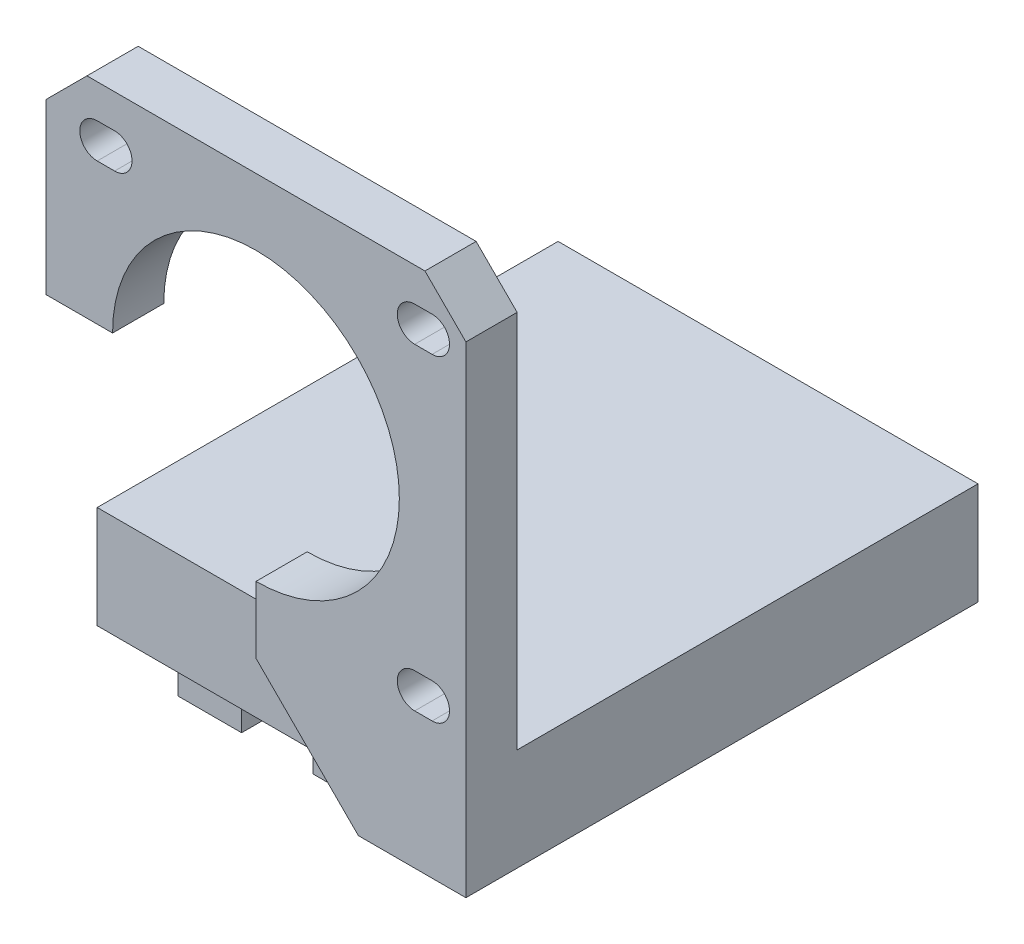
ISO-10303-21;
HEADER;
FILE_DESCRIPTION(('STEP AP214'),'2;1');
FILE_NAME('part.step','',(''),(''),'','','');
FILE_SCHEMA(('AUTOMOTIVE_DESIGN { 1 0 10303 214 1 1 1 1 }'));
ENDSEC;
DATA;
#1=APPLICATION_CONTEXT('core data for automotive mechanical design processes');
#2=APPLICATION_PROTOCOL_DEFINITION('international standard','automotive_design',2000,#1);
#3=PRODUCT_CONTEXT('',#1,'mechanical');
#4=PRODUCT('Part','Part','',(#3));
#5=PRODUCT_RELATED_PRODUCT_CATEGORY('part','',(#4));
#6=PRODUCT_DEFINITION_FORMATION('','',#4);
#7=PRODUCT_DEFINITION_CONTEXT('part definition',#1,'design');
#8=PRODUCT_DEFINITION('design','',#6,#7);
#9=PRODUCT_DEFINITION_SHAPE('','',#8);
#10=(LENGTH_UNIT() NAMED_UNIT(*) SI_UNIT(.MILLI.,.METRE.));
#11=(NAMED_UNIT(*) PLANE_ANGLE_UNIT() SI_UNIT($,.RADIAN.));
#12=(NAMED_UNIT(*) SI_UNIT($,.STERADIAN.) SOLID_ANGLE_UNIT());
#13=UNCERTAINTY_MEASURE_WITH_UNIT(LENGTH_MEASURE(1.E-05),#10,'distance_accuracy_value','');
#14=(GEOMETRIC_REPRESENTATION_CONTEXT(3) GLOBAL_UNCERTAINTY_ASSIGNED_CONTEXT((#13)) GLOBAL_UNIT_ASSIGNED_CONTEXT((#10,
#11,#12)) REPRESENTATION_CONTEXT('',''));
#15=CARTESIAN_POINT('',(0.,0.,0.));
#16=DIRECTION('',(0.,0.,1.));
#17=DIRECTION('',(1.,0.,0.));
#18=AXIS2_PLACEMENT_3D('',#15,#16,#17);
#19=CARTESIAN_POINT('',(0.,0.,0.));
#20=DIRECTION('',(0.,0.,-1.));
#21=DIRECTION('',(-1.,0.,0.));
#22=AXIS2_PLACEMENT_3D('',#19,#20,#21);
#23=PLANE('',#22);
#24=DIRECTION('',(0.,-1.,0.));
#25=VECTOR('',#24,1.);
#26=CARTESIAN_POINT('',(-20.5,0.,0.));
#27=LINE('',#26,#25);
#28=CARTESIAN_POINT('',(-20.5,-20.5,0.));
#29=VERTEX_POINT('',#28);
#30=CARTESIAN_POINT('',(-20.5,-30.5,0.));
#31=VERTEX_POINT('',#30);
#32=EDGE_CURVE('E517',#29,#31,#27,.T.);
#33=ORIENTED_EDGE('',*,*,#32,.T.);
#34=DIRECTION('',(1.,0.,0.));
#35=VECTOR('',#34,1.);
#36=CARTESIAN_POINT('',(10.0000000000003,-30.5,0.));
#37=LINE('',#36,#35);
#38=CARTESIAN_POINT('',(10.0000000000003,-30.5,0.));
#39=VERTEX_POINT('',#38);
#40=EDGE_CURVE('E506',#31,#39,#37,.T.);
#41=ORIENTED_EDGE('',*,*,#40,.T.);
#42=DIRECTION('',(-0.707106781186556,0.707106781186539,0.));
#43=VECTOR('',#42,1.);
#44=CARTESIAN_POINT('',(0.,-20.5,0.));
#45=LINE('',#44,#43);
#46=CARTESIAN_POINT('',(0.,-20.5,0.));
#47=VERTEX_POINT('',#46);
#48=EDGE_CURVE('E508',#39,#47,#45,.T.);
#49=ORIENTED_EDGE('',*,*,#48,.T.);
#50=DIRECTION('',(-1.,0.,0.));
#51=VECTOR('',#50,1.);
#52=CARTESIAN_POINT('',(20.5,-20.5,0.));
#53=LINE('',#52,#51);
#54=EDGE_CURVE('E530',#47,#29,#53,.T.);
#55=ORIENTED_EDGE('',*,*,#54,.T.);
#56=EDGE_LOOP('',(#33,#41,#49,#55));
#57=FACE_BOUND('',#56,.T.);
#58=ADVANCED_FACE('F229',(#57),#23,.F.);
#59=CARTESIAN_POINT('',(-2.45,-30.5,0.));
#60=DIRECTION('',(-1.,0.,0.));
#61=DIRECTION('',(0.,0.,1.));
#62=AXIS2_PLACEMENT_3D('',#59,#60,#61);
#63=PLANE('',#62);
#64=DIRECTION('',(0.,0.,-1.));
#65=VECTOR('',#64,1.);
#66=CARTESIAN_POINT('',(-2.45,-35.5,0.));
#67=LINE('',#66,#65);
#68=CARTESIAN_POINT('',(-2.45,-35.5,-3.));
#69=VERTEX_POINT('',#68);
#70=CARTESIAN_POINT('',(-2.44999999999999,-35.5,-45.));
#71=VERTEX_POINT('',#70);
#72=EDGE_CURVE('E493',#69,#71,#67,.T.);
#73=ORIENTED_EDGE('',*,*,#72,.F.);
#74=DIRECTION('',(0.,1.,0.));
#75=VECTOR('',#74,1.);
#76=CARTESIAN_POINT('',(-2.45,-30.5,-3.));
#77=LINE('',#76,#75);
#78=CARTESIAN_POINT('',(-2.45,-30.5,-3.));
#79=VERTEX_POINT('',#78);
#80=EDGE_CURVE('E12',#69,#79,#77,.T.);
#81=ORIENTED_EDGE('',*,*,#80,.T.);
#82=DIRECTION('',(0.,0.,-1.));
#83=VECTOR('',#82,1.);
#84=CARTESIAN_POINT('',(-2.45,-30.5,0.));
#85=LINE('',#84,#83);
#86=CARTESIAN_POINT('',(-2.45,-30.5,-45.));
#87=VERTEX_POINT('',#86);
#88=EDGE_CURVE('E251',#79,#87,#85,.T.);
#89=ORIENTED_EDGE('',*,*,#88,.T.);
#90=DIRECTION('',(0.,-1.,0.));
#91=VECTOR('',#90,1.);
#92=CARTESIAN_POINT('',(-2.44999999999999,-30.5,-45.));
#93=LINE('',#92,#91);
#94=EDGE_CURVE('E496',#87,#71,#93,.T.);
#95=ORIENTED_EDGE('',*,*,#94,.T.);
#96=EDGE_LOOP('',(#73,#81,#89,#95));
#97=FACE_BOUND('',#96,.T.);
#98=ADVANCED_FACE('F779',(#97),#63,.T.);
#99=CARTESIAN_POINT('',(-15.6,-30.5,0.));
#100=DIRECTION('',(-1.,0.,0.));
#101=DIRECTION('',(0.,0.,1.));
#102=AXIS2_PLACEMENT_3D('',#99,#100,#101);
#103=PLANE('',#102);
#104=DIRECTION('',(0.,0.,-1.));
#105=VECTOR('',#104,1.);
#106=CARTESIAN_POINT('',(-15.6,-35.5,0.));
#107=LINE('',#106,#105);
#108=CARTESIAN_POINT('',(-15.6,-35.5,-3.));
#109=VERTEX_POINT('',#108);
#110=CARTESIAN_POINT('',(-15.6,-35.5,-45.));
#111=VERTEX_POINT('',#110);
#112=EDGE_CURVE('E490',#109,#111,#107,.T.);
#113=ORIENTED_EDGE('',*,*,#112,.F.);
#114=DIRECTION('',(0.,-1.,0.));
#115=VECTOR('',#114,1.);
#116=CARTESIAN_POINT('',(-15.6,-30.5,-3.));
#117=LINE('',#116,#115);
#118=CARTESIAN_POINT('',(-15.6,-30.5,-3.));
#119=VERTEX_POINT('',#118);
#120=EDGE_CURVE('E486',#119,#109,#117,.T.);
#121=ORIENTED_EDGE('',*,*,#120,.F.);
#122=DIRECTION('',(0.,0.,-1.));
#123=VECTOR('',#122,1.);
#124=CARTESIAN_POINT('',(-15.6,-30.5,0.));
#125=LINE('',#124,#123);
#126=CARTESIAN_POINT('',(-15.6,-30.5,-45.));
#127=VERTEX_POINT('',#126);
#128=EDGE_CURVE('E244',#119,#127,#125,.T.);
#129=ORIENTED_EDGE('',*,*,#128,.T.);
#130=DIRECTION('',(0.,-1.,0.));
#131=VECTOR('',#130,1.);
#132=CARTESIAN_POINT('',(-15.6,-30.5,-45.));
#133=LINE('',#132,#131);
#134=EDGE_CURVE('E483',#127,#111,#133,.T.);
#135=ORIENTED_EDGE('',*,*,#134,.T.);
#136=EDGE_LOOP('',(#113,#121,#129,#135));
#137=FACE_BOUND('',#136,.T.);
#138=ADVANCED_FACE('F761',(#137),#103,.T.);
#139=CARTESIAN_POINT('',(0.,0.,5.));
#140=DIRECTION('',(0.,0.,1.));
#141=DIRECTION('',(1.,0.,0.));
#142=AXIS2_PLACEMENT_3D('',#139,#140,#141);
#143=PLANE('',#142);
#144=DIRECTION('',(-1.,0.,0.));
#145=VECTOR('',#144,1.);
#146=CARTESIAN_POINT('',(17.2,17.2,5.));
#147=LINE('',#146,#145);
#148=CARTESIAN_POINT('',(17.2,17.2,5.));
#149=VERTEX_POINT('',#148);
#150=CARTESIAN_POINT('',(15.5,17.2,5.));
#151=VERTEX_POINT('',#150);
#152=EDGE_CURVE('E564',#149,#151,#147,.T.);
#153=ORIENTED_EDGE('',*,*,#152,.F.);
#154=CARTESIAN_POINT('',(17.2,15.5,5.));
#155=DIRECTION('',(0.,0.,1.));
#156=DIRECTION('',(1.,0.,0.));
#157=AXIS2_PLACEMENT_3D('',#154,#155,#156);
#158=CIRCLE('',#157,1.7);
#159=CARTESIAN_POINT('',(17.2,13.8,5.));
#160=VERTEX_POINT('',#159);
#161=EDGE_CURVE('E599',#160,#149,#158,.T.);
#162=ORIENTED_EDGE('',*,*,#161,.F.);
#163=DIRECTION('',(1.,0.,0.));
#164=VECTOR('',#163,1.);
#165=CARTESIAN_POINT('',(15.5,13.8,5.));
#166=LINE('',#165,#164);
#167=CARTESIAN_POINT('',(15.5,13.8,5.));
#168=VERTEX_POINT('',#167);
#169=EDGE_CURVE('E607',#168,#160,#166,.T.);
#170=ORIENTED_EDGE('',*,*,#169,.F.);
#171=CARTESIAN_POINT('',(15.5,15.5,5.));
#172=DIRECTION('',(0.,0.,1.));
#173=DIRECTION('',(1.,0.,0.));
#174=AXIS2_PLACEMENT_3D('',#171,#172,#173);
#175=CIRCLE('',#174,1.7);
#176=EDGE_CURVE('E655',#151,#168,#175,.T.);
#177=ORIENTED_EDGE('',*,*,#176,.F.);
#178=EDGE_LOOP('',(#153,#162,#170,#177));
#179=FACE_BOUND('',#178,.T.);
#180=DIRECTION('',(-1.,0.,0.));
#181=VECTOR('',#180,1.);
#182=CARTESIAN_POINT('',(17.2,-13.8,5.));
#183=LINE('',#182,#181);
#184=CARTESIAN_POINT('',(17.2,-13.8,5.));
#185=VERTEX_POINT('',#184);
#186=CARTESIAN_POINT('',(15.5,-13.8,5.));
#187=VERTEX_POINT('',#186);
#188=EDGE_CURVE('E554',#185,#187,#183,.T.);
#189=ORIENTED_EDGE('',*,*,#188,.F.);
#190=CARTESIAN_POINT('',(17.2,-15.5,5.));
#191=DIRECTION('',(0.,0.,1.));
#192=DIRECTION('',(1.,0.,0.));
#193=AXIS2_PLACEMENT_3D('',#190,#191,#192);
#194=CIRCLE('',#193,1.7);
#195=CARTESIAN_POINT('',(17.2,-17.2,5.));
#196=VERTEX_POINT('',#195);
#197=EDGE_CURVE('E547',#196,#185,#194,.T.);
#198=ORIENTED_EDGE('',*,*,#197,.F.);
#199=DIRECTION('',(1.,0.,0.));
#200=VECTOR('',#199,1.);
#201=CARTESIAN_POINT('',(15.5,-17.2,5.));
#202=LINE('',#201,#200);
#203=CARTESIAN_POINT('',(15.5,-17.2,5.));
#204=VERTEX_POINT('',#203);
#205=EDGE_CURVE('E556',#204,#196,#202,.T.);
#206=ORIENTED_EDGE('',*,*,#205,.F.);
#207=CARTESIAN_POINT('',(15.5,-15.5,5.));
#208=DIRECTION('',(0.,0.,1.));
#209=DIRECTION('',(1.,0.,0.));
#210=AXIS2_PLACEMENT_3D('',#207,#208,#209);
#211=CIRCLE('',#210,1.7);
#212=EDGE_CURVE('E649',#187,#204,#211,.T.);
#213=ORIENTED_EDGE('',*,*,#212,.F.);
#214=EDGE_LOOP('',(#189,#198,#206,#213));
#215=FACE_BOUND('',#214,.T.);
#216=DIRECTION('',(-1.,0.,0.));
#217=VECTOR('',#216,1.);
#218=CARTESIAN_POINT('',(-13.8,17.2,5.));
#219=LINE('',#218,#217);
#220=CARTESIAN_POINT('',(-13.8,17.2,5.));
#221=VERTEX_POINT('',#220);
#222=CARTESIAN_POINT('',(-15.5,17.2,5.));
#223=VERTEX_POINT('',#222);
#224=EDGE_CURVE('E542',#221,#223,#219,.T.);
#225=ORIENTED_EDGE('',*,*,#224,.F.);
#226=CARTESIAN_POINT('',(-13.8,15.5,5.));
#227=DIRECTION('',(0.,0.,1.));
#228=DIRECTION('',(1.,0.,0.));
#229=AXIS2_PLACEMENT_3D('',#226,#227,#228);
#230=CIRCLE('',#229,1.7);
#231=CARTESIAN_POINT('',(-13.8,13.8,5.));
#232=VERTEX_POINT('',#231);
#233=EDGE_CURVE('E575',#232,#221,#230,.T.);
#234=ORIENTED_EDGE('',*,*,#233,.F.);
#235=DIRECTION('',(1.,0.,0.));
#236=VECTOR('',#235,1.);
#237=CARTESIAN_POINT('',(-15.5,13.8,5.));
#238=LINE('',#237,#236);
#239=CARTESIAN_POINT('',(-15.5,13.8,5.));
#240=VERTEX_POINT('',#239);
#241=EDGE_CURVE('E583',#240,#232,#238,.T.);
#242=ORIENTED_EDGE('',*,*,#241,.F.);
#243=CARTESIAN_POINT('',(-15.5,15.5,5.));
#244=DIRECTION('',(0.,0.,1.));
#245=DIRECTION('',(1.,0.,0.));
#246=AXIS2_PLACEMENT_3D('',#243,#244,#245);
#247=CIRCLE('',#246,1.7);
#248=EDGE_CURVE('E661',#223,#240,#247,.T.);
#249=ORIENTED_EDGE('',*,*,#248,.F.);
#250=EDGE_LOOP('',(#225,#234,#242,#249));
#251=FACE_BOUND('',#250,.T.);
#252=CARTESIAN_POINT('',(0.,0.,5.));
#253=DIRECTION('',(0.,0.,1.));
#254=DIRECTION('',(1.,0.,0.));
#255=AXIS2_PLACEMENT_3D('',#252,#253,#254);
#256=CIRCLE('',#255,14.);
#257=CARTESIAN_POINT('',(0.,-14.,5.));
#258=VERTEX_POINT('',#257);
#259=CARTESIAN_POINT('',(-14.,0.,5.));
#260=VERTEX_POINT('',#259);
#261=EDGE_CURVE('E534',#258,#260,#256,.T.);
#262=ORIENTED_EDGE('',*,*,#261,.F.);
#263=DIRECTION('',(0.,-1.,0.));
#264=VECTOR('',#263,1.);
#265=CARTESIAN_POINT('',(0.,0.,5.));
#266=LINE('',#265,#264);
#267=CARTESIAN_POINT('',(0.,-20.5,5.));
#268=VERTEX_POINT('',#267);
#269=EDGE_CURVE('E513',#258,#268,#266,.T.);
#270=ORIENTED_EDGE('',*,*,#269,.T.);
#271=DIRECTION('',(0.707106781186556,-0.707106781186539,0.));
#272=VECTOR('',#271,1.);
#273=CARTESIAN_POINT('',(0.,-20.5,5.));
#274=LINE('',#273,#272);
#275=CARTESIAN_POINT('',(10.0000000000003,-30.5,5.));
#276=VERTEX_POINT('',#275);
#277=EDGE_CURVE('E500',#268,#276,#274,.T.);
#278=ORIENTED_EDGE('',*,*,#277,.T.);
#279=DIRECTION('',(1.,0.,0.));
#280=VECTOR('',#279,1.);
#281=CARTESIAN_POINT('',(10.0000000000003,-30.5,5.));
#282=LINE('',#281,#280);
#283=CARTESIAN_POINT('',(20.5,-30.5,5.));
#284=VERTEX_POINT('',#283);
#285=EDGE_CURVE('E503',#276,#284,#282,.T.);
#286=ORIENTED_EDGE('',*,*,#285,.T.);
#287=DIRECTION('',(0.,1.,0.));
#288=VECTOR('',#287,1.);
#289=CARTESIAN_POINT('',(20.5,0.,5.));
#290=LINE('',#289,#288);
#291=CARTESIAN_POINT('',(20.5,16.5,5.));
#292=VERTEX_POINT('',#291);
#293=EDGE_CURVE('E674',#284,#292,#290,.T.);
#294=ORIENTED_EDGE('',*,*,#293,.T.);
#295=DIRECTION('',(0.707106781186548,-0.707106781186548,0.));
#296=VECTOR('',#295,1.);
#297=CARTESIAN_POINT('',(16.5,20.5,5.));
#298=LINE('',#297,#296);
#299=CARTESIAN_POINT('',(16.5,20.5,5.));
#300=VERTEX_POINT('',#299);
#301=EDGE_CURVE('E670',#300,#292,#298,.T.);
#302=ORIENTED_EDGE('',*,*,#301,.F.);
#303=DIRECTION('',(1.,0.,0.));
#304=VECTOR('',#303,1.);
#305=CARTESIAN_POINT('',(0.,20.5,5.));
#306=LINE('',#305,#304);
#307=CARTESIAN_POINT('',(-16.5,20.5,5.));
#308=VERTEX_POINT('',#307);
#309=EDGE_CURVE('E667',#308,#300,#306,.T.);
#310=ORIENTED_EDGE('',*,*,#309,.F.);
#311=DIRECTION('',(0.707106781186548,0.707106781186548,0.));
#312=VECTOR('',#311,1.);
#313=CARTESIAN_POINT('',(-20.5,16.5,5.));
#314=LINE('',#313,#312);
#315=CARTESIAN_POINT('',(-20.5,16.5,5.));
#316=VERTEX_POINT('',#315);
#317=EDGE_CURVE('E679',#316,#308,#314,.T.);
#318=ORIENTED_EDGE('',*,*,#317,.F.);
#319=DIRECTION('',(0.,-1.,0.));
#320=VECTOR('',#319,1.);
#321=CARTESIAN_POINT('',(-20.5,0.,5.));
#322=LINE('',#321,#320);
#323=CARTESIAN_POINT('',(-20.5,0.,5.));
#324=VERTEX_POINT('',#323);
#325=EDGE_CURVE('E676',#316,#324,#322,.T.);
#326=ORIENTED_EDGE('',*,*,#325,.T.);
#327=DIRECTION('',(-1.,0.,0.));
#328=VECTOR('',#327,1.);
#329=CARTESIAN_POINT('',(0.,0.,5.));
#330=LINE('',#329,#328);
#331=EDGE_CURVE('E518',#260,#324,#330,.T.);
#332=ORIENTED_EDGE('',*,*,#331,.F.);
#333=EDGE_LOOP('',(#262,#270,#278,#286,#294,#302,#310,#318,#326,#332));
#334=FACE_BOUND('',#333,.T.);
#335=ADVANCED_FACE('F724',(#179,#215,#251,#334),#143,.T.);
#336=CARTESIAN_POINT('',(0.,0.,0.));
#337=DIRECTION('',(0.,0.,1.));
#338=DIRECTION('',(1.,0.,0.));
#339=AXIS2_PLACEMENT_3D('',#336,#337,#338);
#340=PLANE('',#339);
#341=CARTESIAN_POINT('',(17.2,-15.5,0.));
#342=DIRECTION('',(0.,0.,1.));
#343=DIRECTION('',(1.,0.,0.));
#344=AXIS2_PLACEMENT_3D('',#341,#342,#343);
#345=CIRCLE('',#344,1.7);
#346=CARTESIAN_POINT('',(17.2,-17.2,0.));
#347=VERTEX_POINT('',#346);
#348=CARTESIAN_POINT('',(17.2,-13.8,0.));
#349=VERTEX_POINT('',#348);
#350=EDGE_CURVE('E550',#347,#349,#345,.T.);
#351=ORIENTED_EDGE('',*,*,#350,.T.);
#352=DIRECTION('',(-1.,0.,0.));
#353=VECTOR('',#352,1.);
#354=CARTESIAN_POINT('',(17.2,-13.8,0.));
#355=LINE('',#354,#353);
#356=CARTESIAN_POINT('',(15.5,-13.8,0.));
#357=VERTEX_POINT('',#356);
#358=EDGE_CURVE('E543',#349,#357,#355,.T.);
#359=ORIENTED_EDGE('',*,*,#358,.T.);
#360=CARTESIAN_POINT('',(15.5,-15.5,0.));
#361=DIRECTION('',(0.,0.,1.));
#362=DIRECTION('',(1.,0.,0.));
#363=AXIS2_PLACEMENT_3D('',#360,#361,#362);
#364=CIRCLE('',#363,1.7);
#365=CARTESIAN_POINT('',(15.5,-17.2,0.));
#366=VERTEX_POINT('',#365);
#367=EDGE_CURVE('E646',#357,#366,#364,.T.);
#368=ORIENTED_EDGE('',*,*,#367,.T.);
#369=DIRECTION('',(1.,0.,0.));
#370=VECTOR('',#369,1.);
#371=CARTESIAN_POINT('',(15.5,-17.2,0.));
#372=LINE('',#371,#370);
#373=EDGE_CURVE('E546',#366,#347,#372,.T.);
#374=ORIENTED_EDGE('',*,*,#373,.T.);
#375=EDGE_LOOP('',(#351,#359,#368,#374));
#376=FACE_BOUND('',#375,.T.);
#377=CARTESIAN_POINT('',(17.2,15.5,0.));
#378=DIRECTION('',(0.,0.,1.));
#379=DIRECTION('',(1.,0.,0.));
#380=AXIS2_PLACEMENT_3D('',#377,#378,#379);
#381=CIRCLE('',#380,1.7);
#382=CARTESIAN_POINT('',(17.2,13.8,0.));
#383=VERTEX_POINT('',#382);
#384=CARTESIAN_POINT('',(17.2,17.2,0.));
#385=VERTEX_POINT('',#384);
#386=EDGE_CURVE('E602',#383,#385,#381,.T.);
#387=ORIENTED_EDGE('',*,*,#386,.T.);
#388=DIRECTION('',(-1.,0.,0.));
#389=VECTOR('',#388,1.);
#390=CARTESIAN_POINT('',(17.2,17.2,0.));
#391=LINE('',#390,#389);
#392=CARTESIAN_POINT('',(15.5,17.2,0.));
#393=VERTEX_POINT('',#392);
#394=EDGE_CURVE('E595',#385,#393,#391,.T.);
#395=ORIENTED_EDGE('',*,*,#394,.T.);
#396=CARTESIAN_POINT('',(15.5,15.5,0.));
#397=DIRECTION('',(0.,0.,1.));
#398=DIRECTION('',(1.,0.,0.));
#399=AXIS2_PLACEMENT_3D('',#396,#397,#398);
#400=CIRCLE('',#399,1.7);
#401=CARTESIAN_POINT('',(15.5,13.8,0.));
#402=VERTEX_POINT('',#401);
#403=EDGE_CURVE('E652',#393,#402,#400,.T.);
#404=ORIENTED_EDGE('',*,*,#403,.T.);
#405=DIRECTION('',(1.,0.,0.));
#406=VECTOR('',#405,1.);
#407=CARTESIAN_POINT('',(15.5,13.8,0.));
#408=LINE('',#407,#406);
#409=EDGE_CURVE('E598',#402,#383,#408,.T.);
#410=ORIENTED_EDGE('',*,*,#409,.T.);
#411=EDGE_LOOP('',(#387,#395,#404,#410));
#412=FACE_BOUND('',#411,.T.);
#413=CARTESIAN_POINT('',(-13.8,15.5,0.));
#414=DIRECTION('',(0.,0.,1.));
#415=DIRECTION('',(1.,0.,0.));
#416=AXIS2_PLACEMENT_3D('',#413,#414,#415);
#417=CIRCLE('',#416,1.7);
#418=CARTESIAN_POINT('',(-13.8,13.8,0.));
#419=VERTEX_POINT('',#418);
#420=CARTESIAN_POINT('',(-13.8,17.2,0.));
#421=VERTEX_POINT('',#420);
#422=EDGE_CURVE('E578',#419,#421,#417,.T.);
#423=ORIENTED_EDGE('',*,*,#422,.T.);
#424=DIRECTION('',(-1.,0.,0.));
#425=VECTOR('',#424,1.);
#426=CARTESIAN_POINT('',(-13.8,17.2,0.));
#427=LINE('',#426,#425);
#428=CARTESIAN_POINT('',(-15.5,17.2,0.));
#429=VERTEX_POINT('',#428);
#430=EDGE_CURVE('E571',#421,#429,#427,.T.);
#431=ORIENTED_EDGE('',*,*,#430,.T.);
#432=CARTESIAN_POINT('',(-15.5,15.5,0.));
#433=DIRECTION('',(0.,0.,1.));
#434=DIRECTION('',(1.,0.,0.));
#435=AXIS2_PLACEMENT_3D('',#432,#433,#434);
#436=CIRCLE('',#435,1.7);
#437=CARTESIAN_POINT('',(-15.5,13.8,0.));
#438=VERTEX_POINT('',#437);
#439=EDGE_CURVE('E658',#429,#438,#436,.T.);
#440=ORIENTED_EDGE('',*,*,#439,.T.);
#441=DIRECTION('',(1.,0.,0.));
#442=VECTOR('',#441,1.);
#443=CARTESIAN_POINT('',(-15.5,13.8,0.));
#444=LINE('',#443,#442);
#445=EDGE_CURVE('E574',#438,#419,#444,.T.);
#446=ORIENTED_EDGE('',*,*,#445,.T.);
#447=EDGE_LOOP('',(#423,#431,#440,#446));
#448=FACE_BOUND('',#447,.T.);
#449=DIRECTION('',(0.,-1.,0.));
#450=VECTOR('',#449,1.);
#451=CARTESIAN_POINT('',(0.,0.,0.));
#452=LINE('',#451,#450);
#453=CARTESIAN_POINT('',(0.,-14.,0.));
#454=VERTEX_POINT('',#453);
#455=EDGE_CURVE('E514',#454,#47,#452,.T.);
#456=ORIENTED_EDGE('',*,*,#455,.F.);
#457=CARTESIAN_POINT('',(0.,0.,0.));
#458=DIRECTION('',(0.,0.,1.));
#459=DIRECTION('',(1.,0.,0.));
#460=AXIS2_PLACEMENT_3D('',#457,#458,#459);
#461=CIRCLE('',#460,14.);
#462=CARTESIAN_POINT('',(-14.,0.,0.));
#463=VERTEX_POINT('',#462);
#464=EDGE_CURVE('E535',#454,#463,#461,.T.);
#465=ORIENTED_EDGE('',*,*,#464,.T.);
#466=DIRECTION('',(-1.,0.,0.));
#467=VECTOR('',#466,1.);
#468=CARTESIAN_POINT('',(0.,0.,0.));
#469=LINE('',#468,#467);
#470=CARTESIAN_POINT('',(-20.5,0.,0.));
#471=VERTEX_POINT('',#470);
#472=EDGE_CURVE('E521',#463,#471,#469,.T.);
#473=ORIENTED_EDGE('',*,*,#472,.T.);
#474=DIRECTION('',(0.,1.,0.));
#475=VECTOR('',#474,1.);
#476=CARTESIAN_POINT('',(-20.5,0.,0.));
#477=LINE('',#476,#475);
#478=CARTESIAN_POINT('',(-20.5,16.5,0.));
#479=VERTEX_POINT('',#478);
#480=EDGE_CURVE('E688',#471,#479,#477,.T.);
#481=ORIENTED_EDGE('',*,*,#480,.T.);
#482=DIRECTION('',(0.707106781186548,0.707106781186548,0.));
#483=VECTOR('',#482,1.);
#484=CARTESIAN_POINT('',(-20.5,16.5,0.));
#485=LINE('',#484,#483);
#486=CARTESIAN_POINT('',(-16.5,20.5,0.));
#487=VERTEX_POINT('',#486);
#488=EDGE_CURVE('E690',#479,#487,#485,.T.);
#489=ORIENTED_EDGE('',*,*,#488,.T.);
#490=DIRECTION('',(-1.,0.,0.));
#491=VECTOR('',#490,1.);
#492=CARTESIAN_POINT('',(0.,20.5,0.));
#493=LINE('',#492,#491);
#494=CARTESIAN_POINT('',(16.5,20.5,0.));
#495=VERTEX_POINT('',#494);
#496=EDGE_CURVE('E671',#495,#487,#493,.T.);
#497=ORIENTED_EDGE('',*,*,#496,.F.);
#498=DIRECTION('',(0.707106781186548,-0.707106781186548,0.));
#499=VECTOR('',#498,1.);
#500=CARTESIAN_POINT('',(16.5,20.5,0.));
#501=LINE('',#500,#499);
#502=CARTESIAN_POINT('',(20.5,16.5,0.));
#503=VERTEX_POINT('',#502);
#504=EDGE_CURVE('E664',#495,#503,#501,.T.);
#505=ORIENTED_EDGE('',*,*,#504,.T.);
#506=DIRECTION('',(0.,-1.,0.));
#507=VECTOR('',#506,1.);
#508=CARTESIAN_POINT('',(20.5,0.,0.));
#509=LINE('',#508,#507);
#510=CARTESIAN_POINT('',(20.5,-20.5,0.));
#511=VERTEX_POINT('',#510);
#512=EDGE_CURVE('E685',#503,#511,#509,.T.);
#513=ORIENTED_EDGE('',*,*,#512,.T.);
#514=DIRECTION('',(-1.,0.,0.));
#515=VECTOR('',#514,1.);
#516=CARTESIAN_POINT('',(20.5,-20.5,0.));
#517=LINE('',#516,#515);
#518=EDGE_CURVE('E622',#511,#47,#517,.T.);
#519=ORIENTED_EDGE('',*,*,#518,.T.);
#520=EDGE_LOOP('',(#456,#465,#473,#481,#489,#497,#505,#513,#519));
#521=FACE_BOUND('',#520,.T.);
#522=ADVANCED_FACE('F717',(#376,#412,#448,#521),#340,.F.);
#523=CARTESIAN_POINT('',(-20.5,0.,5.));
#524=DIRECTION('',(-1.,0.,0.));
#525=DIRECTION('',(0.,0.,1.));
#526=AXIS2_PLACEMENT_3D('',#523,#524,#525);
#527=PLANE('',#526);
#528=DIRECTION('',(0.,0.,1.));
#529=VECTOR('',#528,1.);
#530=CARTESIAN_POINT('',(-20.5,0.,0.));
#531=LINE('',#530,#529);
#532=EDGE_CURVE('E524',#471,#324,#531,.T.);
#533=ORIENTED_EDGE('',*,*,#532,.T.);
#534=ORIENTED_EDGE('',*,*,#325,.F.);
#535=DIRECTION('',(0.,0.,-1.));
#536=VECTOR('',#535,1.);
#537=CARTESIAN_POINT('',(-20.5,16.5,5.));
#538=LINE('',#537,#536);
#539=EDGE_CURVE('E698',#316,#479,#538,.T.);
#540=ORIENTED_EDGE('',*,*,#539,.T.);
#541=ORIENTED_EDGE('',*,*,#480,.F.);
#542=EDGE_LOOP('',(#533,#534,#540,#541));
#543=FACE_BOUND('',#542,.T.);
#544=ADVANCED_FACE('F728',(#543),#527,.T.);
#545=CARTESIAN_POINT('',(0.,0.,0.));
#546=DIRECTION('',(0.,0.,1.));
#547=DIRECTION('',(1.,0.,0.));
#548=AXIS2_PLACEMENT_3D('',#545,#546,#547);
#549=CYLINDRICAL_SURFACE('',#548,14.);
#550=DIRECTION('',(0.,0.,1.));
#551=VECTOR('',#550,1.);
#552=CARTESIAN_POINT('',(0.,-14.,0.));
#553=LINE('',#552,#551);
#554=EDGE_CURVE('E237',#258,#454,#553,.F.);
#555=ORIENTED_EDGE('',*,*,#554,.F.);
#556=ORIENTED_EDGE('',*,*,#261,.T.);
#557=DIRECTION('',(0.,0.,1.));
#558=VECTOR('',#557,1.);
#559=CARTESIAN_POINT('',(-14.,0.,0.));
#560=LINE('',#559,#558);
#561=EDGE_CURVE('E697',#260,#463,#560,.F.);
#562=ORIENTED_EDGE('',*,*,#561,.T.);
#563=ORIENTED_EDGE('',*,*,#464,.F.);
#564=EDGE_LOOP('',(#555,#556,#562,#563));
#565=FACE_BOUND('',#564,.T.);
#566=ADVANCED_FACE('F719',(#565),#549,.F.);
#567=CARTESIAN_POINT('',(0.,20.5,5.));
#568=DIRECTION('',(0.,-1.,0.));
#569=DIRECTION('',(0.,0.,-1.));
#570=AXIS2_PLACEMENT_3D('',#567,#568,#569);
#571=PLANE('',#570);
#572=ORIENTED_EDGE('',*,*,#496,.T.);
#573=DIRECTION('',(0.,0.,-1.));
#574=VECTOR('',#573,1.);
#575=CARTESIAN_POINT('',(-16.5,20.5,5.));
#576=LINE('',#575,#574);
#577=EDGE_CURVE('E695',#308,#487,#576,.T.);
#578=ORIENTED_EDGE('',*,*,#577,.F.);
#579=ORIENTED_EDGE('',*,*,#309,.T.);
#580=DIRECTION('',(0.,0.,-1.));
#581=VECTOR('',#580,1.);
#582=CARTESIAN_POINT('',(16.5,20.5,5.));
#583=LINE('',#582,#581);
#584=EDGE_CURVE('E682',#300,#495,#583,.T.);
#585=ORIENTED_EDGE('',*,*,#584,.T.);
#586=EDGE_LOOP('',(#572,#578,#579,#585));
#587=FACE_BOUND('',#586,.T.);
#588=ADVANCED_FACE('F736',(#587),#571,.F.);
#589=CARTESIAN_POINT('',(-20.5,16.5,5.));
#590=DIRECTION('',(-0.707106781186548,0.707106781186548,0.));
#591=DIRECTION('',(-0.707106781186548,-0.707106781186548,0.));
#592=AXIS2_PLACEMENT_3D('',#589,#590,#591);
#593=PLANE('',#592);
#594=ORIENTED_EDGE('',*,*,#488,.F.);
#595=ORIENTED_EDGE('',*,*,#539,.F.);
#596=ORIENTED_EDGE('',*,*,#317,.T.);
#597=ORIENTED_EDGE('',*,*,#577,.T.);
#598=EDGE_LOOP('',(#594,#595,#596,#597));
#599=FACE_BOUND('',#598,.T.);
#600=ADVANCED_FACE('F732',(#599),#593,.T.);
#601=ORIENTED_EDGE('',*,*,#32,.F.);
#602=DIRECTION('',(0.,0.,1.));
#603=VECTOR('',#602,1.);
#604=CARTESIAN_POINT('',(-20.5,-20.5,-45.));
#605=LINE('',#604,#603);
#606=CARTESIAN_POINT('',(-20.5,-20.5,-45.));
#607=VERTEX_POINT('',#606);
#608=EDGE_CURVE('E639',#607,#29,#605,.T.);
#609=ORIENTED_EDGE('',*,*,#608,.F.);
#610=DIRECTION('',(0.,-1.,0.));
#611=VECTOR('',#610,1.);
#612=CARTESIAN_POINT('',(-20.5,-20.5,-45.));
#613=LINE('',#612,#611);
#614=CARTESIAN_POINT('',(-20.5,-30.5,-45.));
#615=VERTEX_POINT('',#614);
#616=EDGE_CURVE('E623',#607,#615,#613,.T.);
#617=ORIENTED_EDGE('',*,*,#616,.T.);
#618=DIRECTION('',(0.,0.,-1.));
#619=VECTOR('',#618,1.);
#620=CARTESIAN_POINT('',(-20.5,-30.5,4.));
#621=LINE('',#620,#619);
#622=EDGE_CURVE('E644',#31,#615,#621,.T.);
#623=ORIENTED_EDGE('',*,*,#622,.F.);
#624=EDGE_LOOP('',(#601,#609,#617,#623));
#625=FACE_BOUND('',#624,.T.);
#626=ADVANCED_FACE('F752',(#625),#527,.T.);
#627=CARTESIAN_POINT('',(20.5,0.,5.));
#628=DIRECTION('',(1.,0.,0.));
#629=DIRECTION('',(0.,0.,-1.));
#630=AXIS2_PLACEMENT_3D('',#627,#628,#629);
#631=PLANE('',#630);
#632=ORIENTED_EDGE('',*,*,#512,.F.);
#633=DIRECTION('',(0.,0.,-1.));
#634=VECTOR('',#633,1.);
#635=CARTESIAN_POINT('',(20.5,16.5,5.));
#636=LINE('',#635,#634);
#637=EDGE_CURVE('E701',#292,#503,#636,.T.);
#638=ORIENTED_EDGE('',*,*,#637,.F.);
#639=ORIENTED_EDGE('',*,*,#293,.F.);
#640=DIRECTION('',(0.,0.,-1.));
#641=VECTOR('',#640,1.);
#642=CARTESIAN_POINT('',(20.5,-30.5,4.));
#643=LINE('',#642,#641);
#644=CARTESIAN_POINT('',(20.5,-30.5,-45.));
#645=VERTEX_POINT('',#644);
#646=EDGE_CURVE('E642',#284,#645,#643,.T.);
#647=ORIENTED_EDGE('',*,*,#646,.T.);
#648=DIRECTION('',(0.,1.,0.));
#649=VECTOR('',#648,1.);
#650=CARTESIAN_POINT('',(20.5,-30.5,-45.));
#651=LINE('',#650,#649);
#652=CARTESIAN_POINT('',(20.5,-20.5,-45.));
#653=VERTEX_POINT('',#652);
#654=EDGE_CURVE('E629',#645,#653,#651,.T.);
#655=ORIENTED_EDGE('',*,*,#654,.T.);
#656=DIRECTION('',(0.,0.,1.));
#657=VECTOR('',#656,1.);
#658=CARTESIAN_POINT('',(20.5,-20.5,-45.));
#659=LINE('',#658,#657);
#660=EDGE_CURVE('E636',#653,#511,#659,.T.);
#661=ORIENTED_EDGE('',*,*,#660,.T.);
#662=EDGE_LOOP('',(#632,#638,#639,#647,#655,#661));
#663=FACE_BOUND('',#662,.T.);
#664=ADVANCED_FACE('F741',(#663),#631,.T.);
#665=CARTESIAN_POINT('',(16.5,20.5,5.));
#666=DIRECTION('',(0.707106781186548,0.707106781186548,0.));
#667=DIRECTION('',(-0.707106781186548,0.707106781186548,0.));
#668=AXIS2_PLACEMENT_3D('',#665,#666,#667);
#669=PLANE('',#668);
#670=ORIENTED_EDGE('',*,*,#504,.F.);
#671=ORIENTED_EDGE('',*,*,#584,.F.);
#672=ORIENTED_EDGE('',*,*,#301,.T.);
#673=ORIENTED_EDGE('',*,*,#637,.T.);
#674=EDGE_LOOP('',(#670,#671,#672,#673));
#675=FACE_BOUND('',#674,.T.);
#676=ADVANCED_FACE('F231',(#675),#669,.T.);
#677=CARTESIAN_POINT('',(-15.5,15.5,5.));
#678=DIRECTION('',(0.,0.,-1.));
#679=DIRECTION('',(-1.,0.,0.));
#680=AXIS2_PLACEMENT_3D('',#677,#678,#679);
#681=CYLINDRICAL_SURFACE('',#680,1.7);
#682=DIRECTION('',(0.,0.,1.));
#683=VECTOR('',#682,1.);
#684=CARTESIAN_POINT('',(-15.5,17.2,0.));
#685=LINE('',#684,#683);
#686=EDGE_CURVE('E581',#429,#223,#685,.T.);
#687=ORIENTED_EDGE('',*,*,#686,.T.);
#688=ORIENTED_EDGE('',*,*,#248,.T.);
#689=DIRECTION('',(0.,0.,1.));
#690=VECTOR('',#689,1.);
#691=CARTESIAN_POINT('',(-15.5,13.8,0.));
#692=LINE('',#691,#690);
#693=EDGE_CURVE('E591',#438,#240,#692,.T.);
#694=ORIENTED_EDGE('',*,*,#693,.F.);
#695=ORIENTED_EDGE('',*,*,#439,.F.);
#696=EDGE_LOOP('',(#687,#688,#694,#695));
#697=FACE_BOUND('',#696,.T.);
#698=ADVANCED_FACE('F853',(#697),#681,.F.);
#699=CARTESIAN_POINT('',(15.5,15.5,5.));
#700=DIRECTION('',(0.,0.,-1.));
#701=DIRECTION('',(-1.,0.,0.));
#702=AXIS2_PLACEMENT_3D('',#699,#700,#701);
#703=CYLINDRICAL_SURFACE('',#702,1.7);
#704=DIRECTION('',(0.,0.,1.));
#705=VECTOR('',#704,1.);
#706=CARTESIAN_POINT('',(15.5,17.2,0.));
#707=LINE('',#706,#705);
#708=EDGE_CURVE('E605',#393,#151,#707,.T.);
#709=ORIENTED_EDGE('',*,*,#708,.T.);
#710=ORIENTED_EDGE('',*,*,#176,.T.);
#711=DIRECTION('',(0.,0.,1.));
#712=VECTOR('',#711,1.);
#713=CARTESIAN_POINT('',(15.5,13.8,0.));
#714=LINE('',#713,#712);
#715=EDGE_CURVE('E617',#402,#168,#714,.T.);
#716=ORIENTED_EDGE('',*,*,#715,.F.);
#717=ORIENTED_EDGE('',*,*,#403,.F.);
#718=EDGE_LOOP('',(#709,#710,#716,#717));
#719=FACE_BOUND('',#718,.T.);
#720=ADVANCED_FACE('F849',(#719),#703,.F.);
#721=CARTESIAN_POINT('',(15.5,-15.5,5.));
#722=DIRECTION('',(0.,0.,-1.));
#723=DIRECTION('',(-1.,0.,0.));
#724=AXIS2_PLACEMENT_3D('',#721,#722,#723);
#725=CYLINDRICAL_SURFACE('',#724,1.7);
#726=DIRECTION('',(0.,0.,1.));
#727=VECTOR('',#726,1.);
#728=CARTESIAN_POINT('',(15.5,-13.8,0.));
#729=LINE('',#728,#727);
#730=EDGE_CURVE('E553',#357,#187,#729,.T.);
#731=ORIENTED_EDGE('',*,*,#730,.T.);
#732=ORIENTED_EDGE('',*,*,#212,.T.);
#733=DIRECTION('',(0.,0.,1.));
#734=VECTOR('',#733,1.);
#735=CARTESIAN_POINT('',(15.5,-17.2,0.));
#736=LINE('',#735,#734);
#737=EDGE_CURVE('E567',#366,#204,#736,.T.);
#738=ORIENTED_EDGE('',*,*,#737,.F.);
#739=ORIENTED_EDGE('',*,*,#367,.F.);
#740=EDGE_LOOP('',(#731,#732,#738,#739));
#741=FACE_BOUND('',#740,.T.);
#742=ADVANCED_FACE('F846',(#741),#725,.F.);
#743=CARTESIAN_POINT('',(-20.5,-30.5,4.));
#744=DIRECTION('',(0.,1.,0.));
#745=DIRECTION('',(0.,0.,1.));
#746=AXIS2_PLACEMENT_3D('',#743,#744,#745);
#747=PLANE('',#746);
#748=ORIENTED_EDGE('',*,*,#88,.F.);
#749=DIRECTION('',(-1.,0.,0.));
#750=VECTOR('',#749,1.);
#751=CARTESIAN_POINT('',(0.,-30.5,-3.));
#752=LINE('',#751,#750);
#753=CARTESIAN_POINT('',(2.5,-30.5,-3.));
#754=VERTEX_POINT('',#753);
#755=EDGE_CURVE('E449',#754,#79,#752,.T.);
#756=ORIENTED_EDGE('',*,*,#755,.F.);
#757=DIRECTION('',(0.,0.,-1.));
#758=VECTOR('',#757,1.);
#759=CARTESIAN_POINT('',(2.5,-30.5,0.));
#760=LINE('',#759,#758);
#761=CARTESIAN_POINT('',(2.50000000000001,-30.5,-45.));
#762=VERTEX_POINT('',#761);
#763=EDGE_CURVE('E461',#754,#762,#760,.T.);
#764=ORIENTED_EDGE('',*,*,#763,.T.);
#765=DIRECTION('',(1.,0.,0.));
#766=VECTOR('',#765,1.);
#767=CARTESIAN_POINT('',(-20.5,-30.5,-45.));
#768=LINE('',#767,#766);
#769=EDGE_CURVE('E626',#762,#645,#768,.T.);
#770=ORIENTED_EDGE('',*,*,#769,.T.);
#771=ORIENTED_EDGE('',*,*,#646,.F.);
#772=ORIENTED_EDGE('',*,*,#285,.F.);
#773=DIRECTION('',(0.,0.,1.));
#774=VECTOR('',#773,1.);
#775=CARTESIAN_POINT('',(10.0000000000003,-30.5,0.));
#776=LINE('',#775,#774);
#777=EDGE_CURVE('E511',#39,#276,#776,.T.);
#778=ORIENTED_EDGE('',*,*,#777,.F.);
#779=ORIENTED_EDGE('',*,*,#40,.F.);
#780=ORIENTED_EDGE('',*,*,#622,.T.);
#781=EDGE_CURVE('E627',#615,#127,#768,.T.);
#782=ORIENTED_EDGE('',*,*,#781,.T.);
#783=ORIENTED_EDGE('',*,*,#128,.F.);
#784=DIRECTION('',(-1.,0.,0.));
#785=VECTOR('',#784,1.);
#786=CARTESIAN_POINT('',(0.,-30.5,-3.));
#787=LINE('',#786,#785);
#788=CARTESIAN_POINT('',(-9.4,-30.5,-3.));
#789=VERTEX_POINT('',#788);
#790=EDGE_CURVE('E467',#789,#119,#787,.T.);
#791=ORIENTED_EDGE('',*,*,#790,.F.);
#792=DIRECTION('',(0.,0.,-1.));
#793=VECTOR('',#792,1.);
#794=CARTESIAN_POINT('',(-9.4,-30.5,0.));
#795=LINE('',#794,#793);
#796=CARTESIAN_POINT('',(-9.4,-30.5,-45.));
#797=VERTEX_POINT('',#796);
#798=EDGE_CURVE('E456',#789,#797,#795,.T.);
#799=ORIENTED_EDGE('',*,*,#798,.T.);
#800=EDGE_CURVE('E630',#797,#87,#768,.T.);
#801=ORIENTED_EDGE('',*,*,#800,.T.);
#802=EDGE_LOOP('',(#748,#756,#764,#770,#771,#772,#778,#779,#780,#782,#783,#791,#799,#801));
#803=FACE_BOUND('',#802,.T.);
#804=ADVANCED_FACE('F460',(#803),#747,.F.);
#805=CARTESIAN_POINT('',(20.5,-20.5,-45.));
#806=DIRECTION('',(0.,1.,0.));
#807=DIRECTION('',(0.,0.,1.));
#808=AXIS2_PLACEMENT_3D('',#805,#806,#807);
#809=PLANE('',#808);
#810=ORIENTED_EDGE('',*,*,#518,.F.);
#811=ORIENTED_EDGE('',*,*,#660,.F.);
#812=DIRECTION('',(-1.,0.,0.));
#813=VECTOR('',#812,1.);
#814=CARTESIAN_POINT('',(20.5,-20.5,-45.));
#815=LINE('',#814,#813);
#816=EDGE_CURVE('E633',#653,#607,#815,.T.);
#817=ORIENTED_EDGE('',*,*,#816,.T.);
#818=ORIENTED_EDGE('',*,*,#608,.T.);
#819=ORIENTED_EDGE('',*,*,#54,.F.);
#820=EDGE_LOOP('',(#810,#811,#817,#818,#819));
#821=FACE_BOUND('',#820,.T.);
#822=ADVANCED_FACE('F746',(#821),#809,.T.);
#823=CARTESIAN_POINT('',(0.,0.,-45.));
#824=DIRECTION('',(0.,0.,1.));
#825=DIRECTION('',(1.,0.,0.));
#826=AXIS2_PLACEMENT_3D('',#823,#824,#825);
#827=PLANE('',#826);
#828=ORIENTED_EDGE('',*,*,#800,.F.);
#829=DIRECTION('',(0.,-1.,0.));
#830=VECTOR('',#829,1.);
#831=CARTESIAN_POINT('',(-9.4,-30.5,-45.));
#832=LINE('',#831,#830);
#833=CARTESIAN_POINT('',(-9.4,-35.5,-45.));
#834=VERTEX_POINT('',#833);
#835=EDGE_CURVE('E480',#797,#834,#832,.T.);
#836=ORIENTED_EDGE('',*,*,#835,.T.);
#837=DIRECTION('',(-1.,0.,0.));
#838=VECTOR('',#837,1.);
#839=CARTESIAN_POINT('',(-7.4,-35.5,-45.));
#840=LINE('',#839,#838);
#841=EDGE_CURVE('E614',#834,#111,#840,.T.);
#842=ORIENTED_EDGE('',*,*,#841,.T.);
#843=ORIENTED_EDGE('',*,*,#134,.F.);
#844=ORIENTED_EDGE('',*,*,#781,.F.);
#845=ORIENTED_EDGE('',*,*,#616,.F.);
#846=ORIENTED_EDGE('',*,*,#816,.F.);
#847=ORIENTED_EDGE('',*,*,#654,.F.);
#848=ORIENTED_EDGE('',*,*,#769,.F.);
#849=DIRECTION('',(0.,-1.,0.));
#850=VECTOR('',#849,1.);
#851=CARTESIAN_POINT('',(2.50000000000001,-30.5,-45.));
#852=LINE('',#851,#850);
#853=CARTESIAN_POINT('',(2.50000000000001,-35.5,-45.));
#854=VERTEX_POINT('',#853);
#855=EDGE_CURVE('E455',#762,#854,#852,.T.);
#856=ORIENTED_EDGE('',*,*,#855,.T.);
#857=DIRECTION('',(-1.,0.,0.));
#858=VECTOR('',#857,1.);
#859=CARTESIAN_POINT('',(4.5,-35.5,-45.));
#860=LINE('',#859,#858);
#861=EDGE_CURVE('E538',#854,#71,#860,.T.);
#862=ORIENTED_EDGE('',*,*,#861,.T.);
#863=ORIENTED_EDGE('',*,*,#94,.F.);
#864=EDGE_LOOP('',(#828,#836,#842,#843,#844,#845,#846,#847,#848,#856,#862,#863));
#865=FACE_BOUND('',#864,.T.);
#866=ADVANCED_FACE('F758',(#865),#827,.F.);
#867=CARTESIAN_POINT('',(0.,-35.5,0.));
#868=DIRECTION('',(0.,1.,0.));
#869=DIRECTION('',(0.,0.,1.));
#870=AXIS2_PLACEMENT_3D('',#867,#868,#869);
#871=PLANE('',#870);
#872=ORIENTED_EDGE('',*,*,#841,.F.);
#873=DIRECTION('',(0.,0.,-1.));
#874=VECTOR('',#873,1.);
#875=CARTESIAN_POINT('',(-9.4,-35.5,0.));
#876=LINE('',#875,#874);
#877=CARTESIAN_POINT('',(-9.4,-35.5,-3.));
#878=VERTEX_POINT('',#877);
#879=EDGE_CURVE('E462',#878,#834,#876,.T.);
#880=ORIENTED_EDGE('',*,*,#879,.F.);
#881=DIRECTION('',(-1.,0.,0.));
#882=VECTOR('',#881,1.);
#883=CARTESIAN_POINT('',(0.,-35.5,-3.));
#884=LINE('',#883,#882);
#885=EDGE_CURVE('E476',#878,#109,#884,.T.);
#886=ORIENTED_EDGE('',*,*,#885,.T.);
#887=ORIENTED_EDGE('',*,*,#112,.T.);
#888=EDGE_LOOP('',(#872,#880,#886,#887));
#889=FACE_BOUND('',#888,.T.);
#890=ADVANCED_FACE('F763',(#889),#871,.F.);
#891=CARTESIAN_POINT('',(17.2,-13.8,0.));
#892=DIRECTION('',(0.,1.,0.));
#893=DIRECTION('',(0.,0.,1.));
#894=AXIS2_PLACEMENT_3D('',#891,#892,#893);
#895=PLANE('',#894);
#896=ORIENTED_EDGE('',*,*,#188,.T.);
#897=ORIENTED_EDGE('',*,*,#730,.F.);
#898=ORIENTED_EDGE('',*,*,#358,.F.);
#899=DIRECTION('',(0.,0.,1.));
#900=VECTOR('',#899,1.);
#901=CARTESIAN_POINT('',(17.2,-13.8,0.));
#902=LINE('',#901,#900);
#903=EDGE_CURVE('E562',#349,#185,#902,.T.);
#904=ORIENTED_EDGE('',*,*,#903,.T.);
#905=EDGE_LOOP('',(#896,#897,#898,#904));
#906=FACE_BOUND('',#905,.T.);
#907=ADVANCED_FACE('F807',(#906),#895,.F.);
#908=CARTESIAN_POINT('',(17.2,-15.5,0.));
#909=DIRECTION('',(0.,0.,1.));
#910=DIRECTION('',(1.,0.,0.));
#911=AXIS2_PLACEMENT_3D('',#908,#909,#910);
#912=CYLINDRICAL_SURFACE('',#911,1.7);
#913=ORIENTED_EDGE('',*,*,#197,.T.);
#914=ORIENTED_EDGE('',*,*,#903,.F.);
#915=ORIENTED_EDGE('',*,*,#350,.F.);
#916=DIRECTION('',(0.,0.,1.));
#917=VECTOR('',#916,1.);
#918=CARTESIAN_POINT('',(17.2,-17.2,0.));
#919=LINE('',#918,#917);
#920=EDGE_CURVE('E565',#347,#196,#919,.T.);
#921=ORIENTED_EDGE('',*,*,#920,.T.);
#922=EDGE_LOOP('',(#913,#914,#915,#921));
#923=FACE_BOUND('',#922,.T.);
#924=ADVANCED_FACE('F803',(#923),#912,.F.);
#925=CARTESIAN_POINT('',(15.5,-17.2,0.));
#926=DIRECTION('',(0.,-1.,0.));
#927=DIRECTION('',(0.,0.,-1.));
#928=AXIS2_PLACEMENT_3D('',#925,#926,#927);
#929=PLANE('',#928);
#930=ORIENTED_EDGE('',*,*,#205,.T.);
#931=ORIENTED_EDGE('',*,*,#920,.F.);
#932=ORIENTED_EDGE('',*,*,#373,.F.);
#933=ORIENTED_EDGE('',*,*,#737,.T.);
#934=EDGE_LOOP('',(#930,#931,#932,#933));
#935=FACE_BOUND('',#934,.T.);
#936=ADVANCED_FACE('F806',(#935),#929,.F.);
#937=CARTESIAN_POINT('',(17.2,17.2,0.));
#938=DIRECTION('',(0.,1.,0.));
#939=DIRECTION('',(0.,0.,1.));
#940=AXIS2_PLACEMENT_3D('',#937,#938,#939);
#941=PLANE('',#940);
#942=ORIENTED_EDGE('',*,*,#152,.T.);
#943=ORIENTED_EDGE('',*,*,#708,.F.);
#944=ORIENTED_EDGE('',*,*,#394,.F.);
#945=DIRECTION('',(0.,0.,1.));
#946=VECTOR('',#945,1.);
#947=CARTESIAN_POINT('',(17.2,17.2,0.));
#948=LINE('',#947,#946);
#949=EDGE_CURVE('E612',#385,#149,#948,.T.);
#950=ORIENTED_EDGE('',*,*,#949,.T.);
#951=EDGE_LOOP('',(#942,#943,#944,#950));
#952=FACE_BOUND('',#951,.T.);
#953=ADVANCED_FACE('F811',(#952),#941,.F.);
#954=CARTESIAN_POINT('',(17.2,15.5,0.));
#955=DIRECTION('',(0.,0.,1.));
#956=DIRECTION('',(1.,0.,0.));
#957=AXIS2_PLACEMENT_3D('',#954,#955,#956);
#958=CYLINDRICAL_SURFACE('',#957,1.7);
#959=ORIENTED_EDGE('',*,*,#161,.T.);
#960=ORIENTED_EDGE('',*,*,#949,.F.);
#961=ORIENTED_EDGE('',*,*,#386,.F.);
#962=DIRECTION('',(0.,0.,1.));
#963=VECTOR('',#962,1.);
#964=CARTESIAN_POINT('',(17.2,13.8,0.));
#965=LINE('',#964,#963);
#966=EDGE_CURVE('E615',#383,#160,#965,.T.);
#967=ORIENTED_EDGE('',*,*,#966,.T.);
#968=EDGE_LOOP('',(#959,#960,#961,#967));
#969=FACE_BOUND('',#968,.T.);
#970=ADVANCED_FACE('F828',(#969),#958,.F.);
#971=CARTESIAN_POINT('',(15.5,13.8,0.));
#972=DIRECTION('',(0.,-1.,0.));
#973=DIRECTION('',(0.,0.,-1.));
#974=AXIS2_PLACEMENT_3D('',#971,#972,#973);
#975=PLANE('',#974);
#976=ORIENTED_EDGE('',*,*,#169,.T.);
#977=ORIENTED_EDGE('',*,*,#966,.F.);
#978=ORIENTED_EDGE('',*,*,#409,.F.);
#979=ORIENTED_EDGE('',*,*,#715,.T.);
#980=EDGE_LOOP('',(#976,#977,#978,#979));
#981=FACE_BOUND('',#980,.T.);
#982=ADVANCED_FACE('F826',(#981),#975,.F.);
#983=CARTESIAN_POINT('',(-13.8,17.2,0.));
#984=DIRECTION('',(0.,1.,0.));
#985=DIRECTION('',(0.,0.,1.));
#986=AXIS2_PLACEMENT_3D('',#983,#984,#985);
#987=PLANE('',#986);
#988=ORIENTED_EDGE('',*,*,#224,.T.);
#989=ORIENTED_EDGE('',*,*,#686,.F.);
#990=ORIENTED_EDGE('',*,*,#430,.F.);
#991=DIRECTION('',(0.,0.,1.));
#992=VECTOR('',#991,1.);
#993=CARTESIAN_POINT('',(-13.8,17.2,0.));
#994=LINE('',#993,#992);
#995=EDGE_CURVE('E557',#421,#221,#994,.T.);
#996=ORIENTED_EDGE('',*,*,#995,.T.);
#997=EDGE_LOOP('',(#988,#989,#990,#996));
#998=FACE_BOUND('',#997,.T.);
#999=ADVANCED_FACE('F819',(#998),#987,.F.);
#1000=CARTESIAN_POINT('',(-13.8,15.5,0.));
#1001=DIRECTION('',(0.,0.,1.));
#1002=DIRECTION('',(1.,0.,0.));
#1003=AXIS2_PLACEMENT_3D('',#1000,#1001,#1002);
#1004=CYLINDRICAL_SURFACE('',#1003,1.7);
#1005=ORIENTED_EDGE('',*,*,#233,.T.);
#1006=ORIENTED_EDGE('',*,*,#995,.F.);
#1007=ORIENTED_EDGE('',*,*,#422,.F.);
#1008=DIRECTION('',(0.,0.,1.));
#1009=VECTOR('',#1008,1.);
#1010=CARTESIAN_POINT('',(-13.8,13.8,0.));
#1011=LINE('',#1010,#1009);
#1012=EDGE_CURVE('E589',#419,#232,#1011,.T.);
#1013=ORIENTED_EDGE('',*,*,#1012,.T.);
#1014=EDGE_LOOP('',(#1005,#1006,#1007,#1013));
#1015=FACE_BOUND('',#1014,.T.);
#1016=ADVANCED_FACE('F816',(#1015),#1004,.F.);
#1017=CARTESIAN_POINT('',(-15.5,13.8,0.));
#1018=DIRECTION('',(0.,-1.,0.));
#1019=DIRECTION('',(0.,0.,-1.));
#1020=AXIS2_PLACEMENT_3D('',#1017,#1018,#1019);
#1021=PLANE('',#1020);
#1022=ORIENTED_EDGE('',*,*,#241,.T.);
#1023=ORIENTED_EDGE('',*,*,#1012,.F.);
#1024=ORIENTED_EDGE('',*,*,#445,.F.);
#1025=ORIENTED_EDGE('',*,*,#693,.T.);
#1026=EDGE_LOOP('',(#1022,#1023,#1024,#1025));
#1027=FACE_BOUND('',#1026,.T.);
#1028=ADVANCED_FACE('F802',(#1027),#1021,.F.);
#1029=CARTESIAN_POINT('',(0.,-35.5,0.));
#1030=DIRECTION('',(0.,1.,0.));
#1031=DIRECTION('',(0.,0.,1.));
#1032=AXIS2_PLACEMENT_3D('',#1029,#1030,#1031);
#1033=PLANE('',#1032);
#1034=ORIENTED_EDGE('',*,*,#861,.F.);
#1035=DIRECTION('',(0.,0.,-1.));
#1036=VECTOR('',#1035,1.);
#1037=CARTESIAN_POINT('',(2.5,-35.5,0.));
#1038=LINE('',#1037,#1036);
#1039=CARTESIAN_POINT('',(2.5,-35.5,-3.));
#1040=VERTEX_POINT('',#1039);
#1041=EDGE_CURVE('E474',#1040,#854,#1038,.T.);
#1042=ORIENTED_EDGE('',*,*,#1041,.F.);
#1043=DIRECTION('',(-1.,0.,0.));
#1044=VECTOR('',#1043,1.);
#1045=CARTESIAN_POINT('',(0.,-35.5,-3.));
#1046=LINE('',#1045,#1044);
#1047=EDGE_CURVE('E451',#1040,#69,#1046,.T.);
#1048=ORIENTED_EDGE('',*,*,#1047,.T.);
#1049=ORIENTED_EDGE('',*,*,#72,.T.);
#1050=EDGE_LOOP('',(#1034,#1042,#1048,#1049));
#1051=FACE_BOUND('',#1050,.T.);
#1052=ADVANCED_FACE('F777',(#1051),#1033,.F.);
#1053=CARTESIAN_POINT('',(0.,0.,0.));
#1054=DIRECTION('',(0.,1.,0.));
#1055=DIRECTION('',(0.,0.,1.));
#1056=AXIS2_PLACEMENT_3D('',#1053,#1054,#1055);
#1057=PLANE('',#1056);
#1058=ORIENTED_EDGE('',*,*,#331,.T.);
#1059=ORIENTED_EDGE('',*,*,#532,.F.);
#1060=ORIENTED_EDGE('',*,*,#472,.F.);
#1061=ORIENTED_EDGE('',*,*,#561,.F.);
#1062=EDGE_LOOP('',(#1058,#1059,#1060,#1061));
#1063=FACE_BOUND('',#1062,.T.);
#1064=ADVANCED_FACE('F722',(#1063),#1057,.F.);
#1065=CARTESIAN_POINT('',(0.,0.,0.));
#1066=DIRECTION('',(-1.,0.,0.));
#1067=DIRECTION('',(0.,0.,1.));
#1068=AXIS2_PLACEMENT_3D('',#1065,#1066,#1067);
#1069=PLANE('',#1068);
#1070=ORIENTED_EDGE('',*,*,#455,.T.);
#1071=DIRECTION('',(0.,0.,-1.));
#1072=VECTOR('',#1071,1.);
#1073=CARTESIAN_POINT('',(0.,-20.5,5.));
#1074=LINE('',#1073,#1072);
#1075=EDGE_CURVE('E532',#268,#47,#1074,.T.);
#1076=ORIENTED_EDGE('',*,*,#1075,.F.);
#1077=ORIENTED_EDGE('',*,*,#269,.F.);
#1078=ORIENTED_EDGE('',*,*,#554,.T.);
#1079=EDGE_LOOP('',(#1070,#1076,#1077,#1078));
#1080=FACE_BOUND('',#1079,.T.);
#1081=ADVANCED_FACE('F710',(#1080),#1069,.T.);
#1082=CARTESIAN_POINT('',(0.,-20.5,0.));
#1083=DIRECTION('',(0.707106781186539,0.707106781186556,0.));
#1084=DIRECTION('',(-0.707106781186556,0.707106781186539,0.));
#1085=AXIS2_PLACEMENT_3D('',#1082,#1083,#1084);
#1086=PLANE('',#1085);
#1087=ORIENTED_EDGE('',*,*,#777,.T.);
#1088=ORIENTED_EDGE('',*,*,#277,.F.);
#1089=ORIENTED_EDGE('',*,*,#1075,.T.);
#1090=ORIENTED_EDGE('',*,*,#48,.F.);
#1091=EDGE_LOOP('',(#1087,#1088,#1089,#1090));
#1092=FACE_BOUND('',#1091,.T.);
#1093=ADVANCED_FACE('F790',(#1092),#1086,.F.);
#1094=CARTESIAN_POINT('',(0.,-30.5,-3.));
#1095=DIRECTION('',(0.,0.,1.));
#1096=DIRECTION('',(1.,0.,0.));
#1097=AXIS2_PLACEMENT_3D('',#1094,#1095,#1096);
#1098=PLANE('',#1097);
#1099=ORIENTED_EDGE('',*,*,#885,.F.);
#1100=DIRECTION('',(0.,-1.,0.));
#1101=VECTOR('',#1100,1.);
#1102=CARTESIAN_POINT('',(-9.4,-30.5,-3.));
#1103=LINE('',#1102,#1101);
#1104=EDGE_CURVE('E484',#789,#878,#1103,.T.);
#1105=ORIENTED_EDGE('',*,*,#1104,.F.);
#1106=ORIENTED_EDGE('',*,*,#790,.T.);
#1107=ORIENTED_EDGE('',*,*,#120,.T.);
#1108=EDGE_LOOP('',(#1099,#1105,#1106,#1107));
#1109=FACE_BOUND('',#1108,.T.);
#1110=ADVANCED_FACE('F767',(#1109),#1098,.T.);
#1111=CARTESIAN_POINT('',(-9.4,-30.5,0.));
#1112=DIRECTION('',(-1.,0.,0.));
#1113=DIRECTION('',(0.,0.,1.));
#1114=AXIS2_PLACEMENT_3D('',#1111,#1112,#1113);
#1115=PLANE('',#1114);
#1116=ORIENTED_EDGE('',*,*,#879,.T.);
#1117=ORIENTED_EDGE('',*,*,#835,.F.);
#1118=ORIENTED_EDGE('',*,*,#798,.F.);
#1119=ORIENTED_EDGE('',*,*,#1104,.T.);
#1120=EDGE_LOOP('',(#1116,#1117,#1118,#1119));
#1121=FACE_BOUND('',#1120,.T.);
#1122=ADVANCED_FACE('F772',(#1121),#1115,.F.);
#1123=CARTESIAN_POINT('',(2.5,-30.5,0.));
#1124=DIRECTION('',(-1.,0.,0.));
#1125=DIRECTION('',(0.,0.,1.));
#1126=AXIS2_PLACEMENT_3D('',#1123,#1124,#1125);
#1127=PLANE('',#1126);
#1128=ORIENTED_EDGE('',*,*,#1041,.T.);
#1129=ORIENTED_EDGE('',*,*,#855,.F.);
#1130=ORIENTED_EDGE('',*,*,#763,.F.);
#1131=DIRECTION('',(0.,-1.,0.));
#1132=VECTOR('',#1131,1.);
#1133=CARTESIAN_POINT('',(2.5,-30.5,-3.));
#1134=LINE('',#1133,#1132);
#1135=EDGE_CURVE('E446',#754,#1040,#1134,.T.);
#1136=ORIENTED_EDGE('',*,*,#1135,.T.);
#1137=EDGE_LOOP('',(#1128,#1129,#1130,#1136));
#1138=FACE_BOUND('',#1137,.T.);
#1139=ADVANCED_FACE('F465',(#1138),#1127,.F.);
#1140=CARTESIAN_POINT('',(0.,-30.5,-3.));
#1141=DIRECTION('',(0.,0.,1.));
#1142=DIRECTION('',(1.,0.,0.));
#1143=AXIS2_PLACEMENT_3D('',#1140,#1141,#1142);
#1144=PLANE('',#1143);
#1145=ORIENTED_EDGE('',*,*,#1047,.F.);
#1146=ORIENTED_EDGE('',*,*,#1135,.F.);
#1147=ORIENTED_EDGE('',*,*,#755,.T.);
#1148=ORIENTED_EDGE('',*,*,#80,.F.);
#1149=EDGE_LOOP('',(#1145,#1146,#1147,#1148));
#1150=FACE_BOUND('',#1149,.T.);
#1151=ADVANCED_FACE('F448',(#1150),#1144,.T.);
#1152=CLOSED_SHELL('',(#58,#98,#138,#335,#522,#544,#566,#588,#600,#626,#664,#676,#698,#720,#742,
#804,#822,#866,#890,#907,#924,#936,#953,#970,#982,#999,#1016,#1028,#1052,#1064,#1081,#1093,
#1110,#1122,#1139,#1151));
#1153=MANIFOLD_SOLID_BREP('B2',#1152);
#1154=ADVANCED_BREP_SHAPE_REPRESENTATION('',(#18,#1153),#14);
#1155=SHAPE_DEFINITION_REPRESENTATION(#9,#1154);
ENDSEC;
END-ISO-10303-21;
